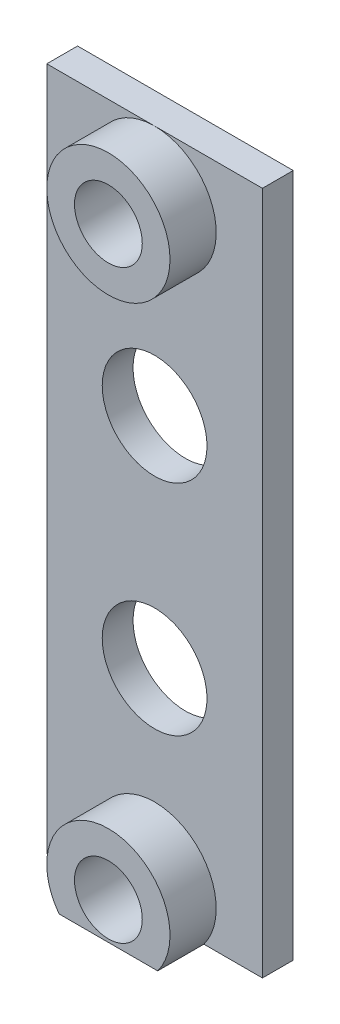
ISO-10303-21;
HEADER;
FILE_DESCRIPTION(('STEP AP214'),'2;1');
FILE_NAME('part.step','',(''),(''),'','','');
FILE_SCHEMA(('AUTOMOTIVE_DESIGN { 1 0 10303 214 1 1 1 1 }'));
ENDSEC;
DATA;
#1=APPLICATION_CONTEXT('core data for automotive mechanical design processes');
#2=APPLICATION_PROTOCOL_DEFINITION('international standard','automotive_design',2000,#1);
#3=PRODUCT_CONTEXT('',#1,'mechanical');
#4=PRODUCT('Part','Part','',(#3));
#5=PRODUCT_RELATED_PRODUCT_CATEGORY('part','',(#4));
#6=PRODUCT_DEFINITION_FORMATION('','',#4);
#7=PRODUCT_DEFINITION_CONTEXT('part definition',#1,'design');
#8=PRODUCT_DEFINITION('design','',#6,#7);
#9=PRODUCT_DEFINITION_SHAPE('','',#8);
#10=(LENGTH_UNIT() NAMED_UNIT(*) SI_UNIT(.MILLI.,.METRE.));
#11=(NAMED_UNIT(*) PLANE_ANGLE_UNIT() SI_UNIT($,.RADIAN.));
#12=(NAMED_UNIT(*) SI_UNIT($,.STERADIAN.) SOLID_ANGLE_UNIT());
#13=UNCERTAINTY_MEASURE_WITH_UNIT(LENGTH_MEASURE(1.E-05),#10,'distance_accuracy_value','');
#14=(GEOMETRIC_REPRESENTATION_CONTEXT(3) GLOBAL_UNCERTAINTY_ASSIGNED_CONTEXT((#13)) GLOBAL_UNIT_ASSIGNED_CONTEXT((#10,
#11,#12)) REPRESENTATION_CONTEXT('',''));
#15=CARTESIAN_POINT('',(0.,0.,0.));
#16=DIRECTION('',(0.,0.,1.));
#17=DIRECTION('',(1.,0.,0.));
#18=AXIS2_PLACEMENT_3D('',#15,#16,#17);
#19=CARTESIAN_POINT('',(-35.518684277368,-49.5,35.5));
#20=DIRECTION('',(1.,0.,0.));
#21=DIRECTION('',(0.,0.,-1.));
#22=AXIS2_PLACEMENT_3D('',#19,#20,#21);
#23=PLANE('',#22);
#24=DIRECTION('',(0.,0.,-1.));
#25=VECTOR('',#24,1.);
#26=CARTESIAN_POINT('',(-35.518684277368,-48.7,35.5));
#27=LINE('',#26,#25);
#28=CARTESIAN_POINT('',(-35.518684277368,-48.7,35.5));
#29=VERTEX_POINT('',#28);
#30=CARTESIAN_POINT('',(-35.518684277368,-48.7,34.5));
#31=VERTEX_POINT('',#30);
#32=EDGE_CURVE('E245',#29,#31,#27,.T.);
#33=ORIENTED_EDGE('',*,*,#32,.F.);
#34=DIRECTION('',(0.,-1.,0.));
#35=VECTOR('',#34,1.);
#36=CARTESIAN_POINT('',(-35.518684277368,-49.5,35.5));
#37=LINE('',#36,#35);
#38=CARTESIAN_POINT('',(-35.518684277368,-26.5,35.5));
#39=VERTEX_POINT('',#38);
#40=EDGE_CURVE('E84',#39,#29,#37,.T.);
#41=ORIENTED_EDGE('',*,*,#40,.F.);
#42=DIRECTION('',(0.,0.,-1.));
#43=VECTOR('',#42,1.);
#44=CARTESIAN_POINT('',(-35.518684277368,-26.5,35.5));
#45=LINE('',#44,#43);
#46=CARTESIAN_POINT('',(-35.518684277368,-26.5,34.5));
#47=VERTEX_POINT('',#46);
#48=EDGE_CURVE('E77',#39,#47,#45,.T.);
#49=ORIENTED_EDGE('',*,*,#48,.T.);
#50=DIRECTION('',(0.,-1.,0.));
#51=VECTOR('',#50,1.);
#52=CARTESIAN_POINT('',(-35.518684277368,-49.5,34.5));
#53=LINE('',#52,#51);
#54=EDGE_CURVE('E91',#47,#31,#53,.T.);
#55=ORIENTED_EDGE('',*,*,#54,.T.);
#56=EDGE_LOOP('',(#33,#41,#49,#55));
#57=FACE_BOUND('',#56,.T.);
#58=ADVANCED_FACE('F38',(#57),#23,.F.);
#59=CARTESIAN_POINT('',(-28.518684277368,-49.5,35.5));
#60=DIRECTION('',(-1.,0.,0.));
#61=DIRECTION('',(0.,0.,1.));
#62=AXIS2_PLACEMENT_3D('',#59,#60,#61);
#63=PLANE('',#62);
#64=DIRECTION('',(0.,0.,1.));
#65=VECTOR('',#64,1.);
#66=CARTESIAN_POINT('',(-28.518684277368,-48.7,35.5));
#67=LINE('',#66,#65);
#68=CARTESIAN_POINT('',(-28.518684277368,-48.7,34.5));
#69=VERTEX_POINT('',#68);
#70=CARTESIAN_POINT('',(-28.518684277368,-48.7,35.5));
#71=VERTEX_POINT('',#70);
#72=EDGE_CURVE('E247',#69,#71,#67,.T.);
#73=ORIENTED_EDGE('',*,*,#72,.F.);
#74=DIRECTION('',(0.,1.,0.));
#75=VECTOR('',#74,1.);
#76=CARTESIAN_POINT('',(-28.518684277368,-49.5,34.5));
#77=LINE('',#76,#75);
#78=CARTESIAN_POINT('',(-28.518684277368,-26.5,34.5));
#79=VERTEX_POINT('',#78);
#80=EDGE_CURVE('E85',#69,#79,#77,.T.);
#81=ORIENTED_EDGE('',*,*,#80,.T.);
#82=DIRECTION('',(0.,0.,-1.));
#83=VECTOR('',#82,1.);
#84=CARTESIAN_POINT('',(-28.518684277368,-26.5,35.5));
#85=LINE('',#84,#83);
#86=CARTESIAN_POINT('',(-28.518684277368,-26.5,35.5));
#87=VERTEX_POINT('',#86);
#88=EDGE_CURVE('E45',#87,#79,#85,.T.);
#89=ORIENTED_EDGE('',*,*,#88,.F.);
#90=DIRECTION('',(0.,1.,0.));
#91=VECTOR('',#90,1.);
#92=CARTESIAN_POINT('',(-28.518684277368,-49.5,35.5));
#93=LINE('',#92,#91);
#94=EDGE_CURVE('E141',#71,#87,#93,.T.);
#95=ORIENTED_EDGE('',*,*,#94,.F.);
#96=EDGE_LOOP('',(#73,#81,#89,#95));
#97=FACE_BOUND('',#96,.T.);
#98=ADVANCED_FACE('F187',(#97),#63,.F.);
#99=CARTESIAN_POINT('',(0.,0.,35.5));
#100=DIRECTION('',(0.,0.,-1.));
#101=DIRECTION('',(-1.,0.,0.));
#102=AXIS2_PLACEMENT_3D('',#99,#100,#101);
#103=PLANE('',#102);
#104=CARTESIAN_POINT('',(-32.018684277368,-34.6434023405005,35.5));
#105=DIRECTION('',(0.,0.,-1.));
#106=DIRECTION('',(-1.,0.,0.));
#107=AXIS2_PLACEMENT_3D('',#104,#105,#106);
#108=CIRCLE('',#107,1.7);
#109=CARTESIAN_POINT('',(-33.718684277368,-34.6434023405005,35.5));
#110=VERTEX_POINT('',#109);
#111=EDGE_CURVE('E121',#110,#110,#108,.F.);
#112=ORIENTED_EDGE('',*,*,#111,.F.);
#113=EDGE_LOOP('',(#112));
#114=FACE_BOUND('',#113,.T.);
#115=CARTESIAN_POINT('',(-32.018684277368,-41.7454165571395,35.5));
#116=DIRECTION('',(0.,0.,-1.));
#117=DIRECTION('',(-1.,0.,0.));
#118=AXIS2_PLACEMENT_3D('',#115,#116,#117);
#119=CIRCLE('',#118,1.7);
#120=CARTESIAN_POINT('',(-33.718684277368,-41.7454165571395,35.5));
#121=VERTEX_POINT('',#120);
#122=EDGE_CURVE('E118',#121,#121,#119,.F.);
#123=ORIENTED_EDGE('',*,*,#122,.F.);
#124=EDGE_LOOP('',(#123));
#125=FACE_BOUND('',#124,.T.);
#126=DIRECTION('',(-1.,0.,0.));
#127=VECTOR('',#126,1.);
#128=CARTESIAN_POINT('',(0.,-48.7,35.5));
#129=LINE('',#128,#127);
#130=CARTESIAN_POINT('',(-30.418684277368,-48.7,35.5));
#131=VERTEX_POINT('',#130);
#132=EDGE_CURVE('E249',#71,#131,#129,.T.);
#133=ORIENTED_EDGE('',*,*,#132,.F.);
#134=ORIENTED_EDGE('',*,*,#94,.T.);
#135=DIRECTION('',(-1.,0.,0.));
#136=VECTOR('',#135,1.);
#137=CARTESIAN_POINT('',(-35.518684277368,-26.5,35.5));
#138=LINE('',#137,#136);
#139=CARTESIAN_POINT('',(-32.018684277368,-26.5,35.5));
#140=VERTEX_POINT('',#139);
#141=EDGE_CURVE('E92',#87,#140,#138,.T.);
#142=ORIENTED_EDGE('',*,*,#141,.T.);
#143=CARTESIAN_POINT('',(-32.018684277368,-28.5,35.5));
#144=DIRECTION('',(0.,0.,1.));
#145=DIRECTION('',(1.,0.,0.));
#146=AXIS2_PLACEMENT_3D('',#143,#144,#145);
#147=CIRCLE('',#146,2.);
#148=EDGE_CURVE('E134',#140,#140,#147,.T.);
#149=ORIENTED_EDGE('',*,*,#148,.F.);
#150=EDGE_CURVE('E60',#140,#39,#138,.T.);
#151=ORIENTED_EDGE('',*,*,#150,.T.);
#152=ORIENTED_EDGE('',*,*,#40,.T.);
#153=CARTESIAN_POINT('',(-33.618684277368,-48.7,35.5));
#154=VERTEX_POINT('',#153);
#155=EDGE_CURVE('E172',#154,#29,#129,.T.);
#156=ORIENTED_EDGE('',*,*,#155,.F.);
#157=CARTESIAN_POINT('',(-32.018684277368,-47.5,35.5));
#158=DIRECTION('',(0.,0.,1.));
#159=DIRECTION('',(1.,0.,0.));
#160=AXIS2_PLACEMENT_3D('',#157,#158,#159);
#161=CIRCLE('',#160,2.);
#162=EDGE_CURVE('E102',#131,#154,#161,.T.);
#163=ORIENTED_EDGE('',*,*,#162,.F.);
#164=EDGE_LOOP('',(#133,#134,#142,#149,#151,#152,#156,#163));
#165=FACE_BOUND('',#164,.T.);
#166=ADVANCED_FACE('F145',(#114,#125,#165),#103,.F.);
#167=CARTESIAN_POINT('',(0.,0.,34.5));
#168=DIRECTION('',(0.,0.,-1.));
#169=DIRECTION('',(-1.,0.,0.));
#170=AXIS2_PLACEMENT_3D('',#167,#168,#169);
#171=PLANE('',#170);
#172=CARTESIAN_POINT('',(-32.018684277368,-28.5,34.5));
#173=DIRECTION('',(0.,0.,-1.));
#174=DIRECTION('',(-1.,0.,0.));
#175=AXIS2_PLACEMENT_3D('',#172,#173,#174);
#176=CIRCLE('',#175,1.1);
#177=CARTESIAN_POINT('',(-33.118684277368,-28.5,34.5));
#178=VERTEX_POINT('',#177);
#179=EDGE_CURVE('E111',#178,#178,#176,.F.);
#180=ORIENTED_EDGE('',*,*,#179,.T.);
#181=EDGE_LOOP('',(#180));
#182=FACE_BOUND('',#181,.T.);
#183=CARTESIAN_POINT('',(-32.018684277368,-47.5,34.5));
#184=DIRECTION('',(0.,0.,-1.));
#185=DIRECTION('',(-1.,0.,0.));
#186=AXIS2_PLACEMENT_3D('',#183,#184,#185);
#187=CIRCLE('',#186,1.1);
#188=CARTESIAN_POINT('',(-33.118684277368,-47.5,34.5));
#189=VERTEX_POINT('',#188);
#190=EDGE_CURVE('E115',#189,#189,#187,.F.);
#191=ORIENTED_EDGE('',*,*,#190,.T.);
#192=EDGE_LOOP('',(#191));
#193=FACE_BOUND('',#192,.T.);
#194=CARTESIAN_POINT('',(-32.018684277368,-34.6434023405005,34.5));
#195=DIRECTION('',(0.,0.,-1.));
#196=DIRECTION('',(-1.,0.,0.));
#197=AXIS2_PLACEMENT_3D('',#194,#195,#196);
#198=CIRCLE('',#197,1.7);
#199=CARTESIAN_POINT('',(-33.718684277368,-34.6434023405005,34.5));
#200=VERTEX_POINT('',#199);
#201=EDGE_CURVE('E119',#200,#200,#198,.F.);
#202=ORIENTED_EDGE('',*,*,#201,.T.);
#203=EDGE_LOOP('',(#202));
#204=FACE_BOUND('',#203,.T.);
#205=CARTESIAN_POINT('',(-32.018684277368,-41.7454165571395,34.5));
#206=DIRECTION('',(0.,0.,-1.));
#207=DIRECTION('',(-1.,0.,0.));
#208=AXIS2_PLACEMENT_3D('',#205,#206,#207);
#209=CIRCLE('',#208,1.7);
#210=CARTESIAN_POINT('',(-33.718684277368,-41.7454165571395,34.5));
#211=VERTEX_POINT('',#210);
#212=EDGE_CURVE('E116',#211,#211,#209,.F.);
#213=ORIENTED_EDGE('',*,*,#212,.T.);
#214=EDGE_LOOP('',(#213));
#215=FACE_BOUND('',#214,.T.);
#216=ORIENTED_EDGE('',*,*,#80,.F.);
#217=DIRECTION('',(-1.,0.,0.));
#218=VECTOR('',#217,1.);
#219=CARTESIAN_POINT('',(0.,-48.7,34.5));
#220=LINE('',#219,#218);
#221=EDGE_CURVE('E97',#69,#31,#220,.T.);
#222=ORIENTED_EDGE('',*,*,#221,.T.);
#223=ORIENTED_EDGE('',*,*,#54,.F.);
#224=DIRECTION('',(-1.,0.,0.));
#225=VECTOR('',#224,1.);
#226=CARTESIAN_POINT('',(-35.518684277368,-26.5,34.5));
#227=LINE('',#226,#225);
#228=EDGE_CURVE('E74',#79,#47,#227,.T.);
#229=ORIENTED_EDGE('',*,*,#228,.F.);
#230=EDGE_LOOP('',(#216,#222,#223,#229));
#231=FACE_BOUND('',#230,.T.);
#232=ADVANCED_FACE('F95',(#182,#193,#204,#215,#231),#171,.T.);
#233=CARTESIAN_POINT('',(-32.018684277368,-47.5,37.));
#234=DIRECTION('',(0.,0.,-1.));
#235=DIRECTION('',(-1.,0.,0.));
#236=AXIS2_PLACEMENT_3D('',#233,#234,#235);
#237=CYLINDRICAL_SURFACE('',#236,2.);
#238=DIRECTION('',(0.,0.,-1.));
#239=VECTOR('',#238,1.);
#240=CARTESIAN_POINT('',(-33.618684277368,-48.7,37.));
#241=LINE('',#240,#239);
#242=CARTESIAN_POINT('',(-33.618684277368,-48.7,37.));
#243=VERTEX_POINT('',#242);
#244=EDGE_CURVE('E165',#243,#154,#241,.T.);
#245=ORIENTED_EDGE('',*,*,#244,.F.);
#246=CARTESIAN_POINT('',(-32.018684277368,-47.5,37.));
#247=DIRECTION('',(0.,0.,1.));
#248=DIRECTION('',(1.,0.,0.));
#249=AXIS2_PLACEMENT_3D('',#246,#247,#248);
#250=CIRCLE('',#249,2.);
#251=CARTESIAN_POINT('',(-30.418684277368,-48.7,37.));
#252=VERTEX_POINT('',#251);
#253=EDGE_CURVE('E98',#252,#243,#250,.T.);
#254=ORIENTED_EDGE('',*,*,#253,.F.);
#255=DIRECTION('',(0.,0.,-1.));
#256=VECTOR('',#255,1.);
#257=CARTESIAN_POINT('',(-30.418684277368,-48.7,37.));
#258=LINE('',#257,#256);
#259=EDGE_CURVE('E52',#131,#252,#258,.F.);
#260=ORIENTED_EDGE('',*,*,#259,.F.);
#261=ORIENTED_EDGE('',*,*,#162,.T.);
#262=EDGE_LOOP('',(#245,#254,#260,#261));
#263=FACE_BOUND('',#262,.T.);
#264=ADVANCED_FACE('F170',(#263),#237,.T.);
#265=CARTESIAN_POINT('',(-32.018684277368,-47.5,37.));
#266=DIRECTION('',(0.,0.,1.));
#267=DIRECTION('',(1.,0.,0.));
#268=AXIS2_PLACEMENT_3D('',#265,#266,#267);
#269=PLANE('',#268);
#270=CARTESIAN_POINT('',(-32.018684277368,-47.5,37.));
#271=DIRECTION('',(0.,0.,1.));
#272=DIRECTION('',(1.,0.,0.));
#273=AXIS2_PLACEMENT_3D('',#270,#271,#272);
#274=CIRCLE('',#273,1.1);
#275=CARTESIAN_POINT('',(-30.918684277368,-47.5,37.));
#276=VERTEX_POINT('',#275);
#277=EDGE_CURVE('E112',#276,#276,#274,.F.);
#278=ORIENTED_EDGE('',*,*,#277,.T.);
#279=EDGE_LOOP('',(#278));
#280=FACE_BOUND('',#279,.T.);
#281=ORIENTED_EDGE('',*,*,#253,.T.);
#282=DIRECTION('',(1.,0.,0.));
#283=VECTOR('',#282,1.);
#284=CARTESIAN_POINT('',(-32.018684277368,-48.7,37.));
#285=LINE('',#284,#283);
#286=EDGE_CURVE('E11',#243,#252,#285,.T.);
#287=ORIENTED_EDGE('',*,*,#286,.T.);
#288=EDGE_LOOP('',(#281,#287));
#289=FACE_BOUND('',#288,.T.);
#290=ADVANCED_FACE('F174',(#280,#289),#269,.T.);
#291=CARTESIAN_POINT('',(-35.518684277368,-26.5,35.5));
#292=DIRECTION('',(0.,-1.,0.));
#293=DIRECTION('',(0.,0.,-1.));
#294=AXIS2_PLACEMENT_3D('',#291,#292,#293);
#295=PLANE('',#294);
#296=ORIENTED_EDGE('',*,*,#228,.T.);
#297=ORIENTED_EDGE('',*,*,#48,.F.);
#298=ORIENTED_EDGE('',*,*,#150,.F.);
#299=ORIENTED_EDGE('',*,*,#141,.F.);
#300=ORIENTED_EDGE('',*,*,#88,.T.);
#301=EDGE_LOOP('',(#296,#297,#298,#299,#300));
#302=FACE_BOUND('',#301,.T.);
#303=ADVANCED_FACE('F76',(#302),#295,.F.);
#304=CARTESIAN_POINT('',(-32.018684277368,-28.5,37.));
#305=DIRECTION('',(0.,0.,-1.));
#306=DIRECTION('',(-1.,0.,0.));
#307=AXIS2_PLACEMENT_3D('',#304,#305,#306);
#308=CYLINDRICAL_SURFACE('',#307,2.);
#309=CARTESIAN_POINT('',(-32.018684277368,-28.5,37.));
#310=DIRECTION('',(0.,0.,1.));
#311=DIRECTION('',(1.,0.,0.));
#312=AXIS2_PLACEMENT_3D('',#309,#310,#311);
#313=CIRCLE('',#312,2.);
#314=CARTESIAN_POINT('',(-30.018684277368,-28.5,37.));
#315=VERTEX_POINT('',#314);
#316=EDGE_CURVE('E125',#315,#315,#313,.T.);
#317=ORIENTED_EDGE('',*,*,#316,.F.);
#318=EDGE_LOOP('',(#317));
#319=FACE_BOUND('',#318,.T.);
#320=ORIENTED_EDGE('',*,*,#148,.T.);
#321=EDGE_LOOP('',(#320));
#322=FACE_BOUND('',#321,.T.);
#323=ADVANCED_FACE('F182',(#319,#322),#308,.T.);
#324=CARTESIAN_POINT('',(-32.018684277368,-28.5,37.));
#325=DIRECTION('',(0.,0.,1.));
#326=DIRECTION('',(1.,0.,0.));
#327=AXIS2_PLACEMENT_3D('',#324,#325,#326);
#328=PLANE('',#327);
#329=CARTESIAN_POINT('',(-32.018684277368,-28.5,37.));
#330=DIRECTION('',(0.,0.,1.));
#331=DIRECTION('',(1.,0.,0.));
#332=AXIS2_PLACEMENT_3D('',#329,#330,#331);
#333=CIRCLE('',#332,1.1);
#334=CARTESIAN_POINT('',(-30.918684277368,-28.5,37.));
#335=VERTEX_POINT('',#334);
#336=EDGE_CURVE('E108',#335,#335,#333,.F.);
#337=ORIENTED_EDGE('',*,*,#336,.T.);
#338=EDGE_LOOP('',(#337));
#339=FACE_BOUND('',#338,.T.);
#340=ORIENTED_EDGE('',*,*,#316,.T.);
#341=EDGE_LOOP('',(#340));
#342=FACE_BOUND('',#341,.T.);
#343=ADVANCED_FACE('F228',(#339,#342),#328,.T.);
#344=CARTESIAN_POINT('',(-32.018684277368,-28.5,38.));
#345=DIRECTION('',(0.,0.,-1.));
#346=DIRECTION('',(-1.,0.,0.));
#347=AXIS2_PLACEMENT_3D('',#344,#345,#346);
#348=CYLINDRICAL_SURFACE('',#347,1.1);
#349=ORIENTED_EDGE('',*,*,#179,.F.);
#350=EDGE_LOOP('',(#349));
#351=FACE_BOUND('',#350,.T.);
#352=ORIENTED_EDGE('',*,*,#336,.F.);
#353=EDGE_LOOP('',(#352));
#354=FACE_BOUND('',#353,.T.);
#355=ADVANCED_FACE('F222',(#351,#354),#348,.F.);
#356=CARTESIAN_POINT('',(-32.018684277368,-47.5,38.));
#357=DIRECTION('',(0.,0.,-1.));
#358=DIRECTION('',(-1.,0.,0.));
#359=AXIS2_PLACEMENT_3D('',#356,#357,#358);
#360=CYLINDRICAL_SURFACE('',#359,1.1);
#361=ORIENTED_EDGE('',*,*,#190,.F.);
#362=EDGE_LOOP('',(#361));
#363=FACE_BOUND('',#362,.T.);
#364=ORIENTED_EDGE('',*,*,#277,.F.);
#365=EDGE_LOOP('',(#364));
#366=FACE_BOUND('',#365,.T.);
#367=ADVANCED_FACE('F214',(#363,#366),#360,.F.);
#368=CARTESIAN_POINT('',(-32.018684277368,-41.7454165571395,38.));
#369=DIRECTION('',(0.,0.,-1.));
#370=DIRECTION('',(-1.,0.,0.));
#371=AXIS2_PLACEMENT_3D('',#368,#369,#370);
#372=CYLINDRICAL_SURFACE('',#371,1.7);
#373=ORIENTED_EDGE('',*,*,#212,.F.);
#374=EDGE_LOOP('',(#373));
#375=FACE_BOUND('',#374,.T.);
#376=ORIENTED_EDGE('',*,*,#122,.T.);
#377=EDGE_LOOP('',(#376));
#378=FACE_BOUND('',#377,.T.);
#379=ADVANCED_FACE('F211',(#375,#378),#372,.F.);
#380=CARTESIAN_POINT('',(-32.018684277368,-34.6434023405005,38.));
#381=DIRECTION('',(0.,0.,-1.));
#382=DIRECTION('',(-1.,0.,0.));
#383=AXIS2_PLACEMENT_3D('',#380,#381,#382);
#384=CYLINDRICAL_SURFACE('',#383,1.7);
#385=ORIENTED_EDGE('',*,*,#201,.F.);
#386=EDGE_LOOP('',(#385));
#387=FACE_BOUND('',#386,.T.);
#388=ORIENTED_EDGE('',*,*,#111,.T.);
#389=EDGE_LOOP('',(#388));
#390=FACE_BOUND('',#389,.T.);
#391=ADVANCED_FACE('F213',(#387,#390),#384,.F.);
#392=CARTESIAN_POINT('',(-25.,-48.7,39.));
#393=DIRECTION('',(0.,-1.,0.));
#394=DIRECTION('',(0.,0.,-1.));
#395=AXIS2_PLACEMENT_3D('',#392,#393,#394);
#396=PLANE('',#395);
#397=ORIENTED_EDGE('',*,*,#72,.T.);
#398=ORIENTED_EDGE('',*,*,#132,.T.);
#399=ORIENTED_EDGE('',*,*,#259,.T.);
#400=ORIENTED_EDGE('',*,*,#286,.F.);
#401=ORIENTED_EDGE('',*,*,#244,.T.);
#402=ORIENTED_EDGE('',*,*,#155,.T.);
#403=ORIENTED_EDGE('',*,*,#32,.T.);
#404=ORIENTED_EDGE('',*,*,#221,.F.);
#405=EDGE_LOOP('',(#397,#398,#399,#400,#401,#402,#403,#404));
#406=FACE_BOUND('',#405,.T.);
#407=ADVANCED_FACE('F164',(#406),#396,.T.);
#408=CLOSED_SHELL('',(#58,#98,#166,#232,#264,#290,#303,#323,#343,#355,#367,#379,#391,#407));
#409=MANIFOLD_SOLID_BREP('B2',#408);
#410=ADVANCED_BREP_SHAPE_REPRESENTATION('',(#18,#409),#14);
#411=SHAPE_DEFINITION_REPRESENTATION(#9,#410);
ENDSEC;
END-ISO-10303-21;
